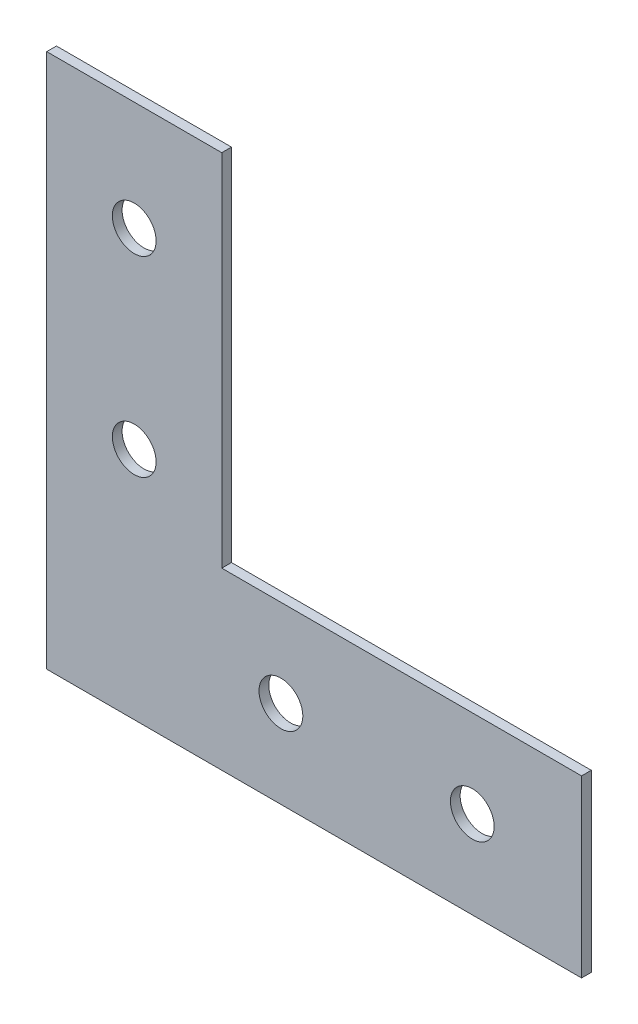
ISO-10303-21;
HEADER;
FILE_DESCRIPTION(('STEP AP214'),'2;1');
FILE_NAME('part.step','',(''),(''),'','','');
FILE_SCHEMA(('AUTOMOTIVE_DESIGN { 1 0 10303 214 1 1 1 1 }'));
ENDSEC;
DATA;
#1=APPLICATION_CONTEXT('core data for automotive mechanical design processes');
#2=APPLICATION_PROTOCOL_DEFINITION('international standard','automotive_design',2000,#1);
#3=PRODUCT_CONTEXT('',#1,'mechanical');
#4=PRODUCT('Part','Part','',(#3));
#5=PRODUCT_RELATED_PRODUCT_CATEGORY('part','',(#4));
#6=PRODUCT_DEFINITION_FORMATION('','',#4);
#7=PRODUCT_DEFINITION_CONTEXT('part definition',#1,'design');
#8=PRODUCT_DEFINITION('design','',#6,#7);
#9=PRODUCT_DEFINITION_SHAPE('','',#8);
#10=(LENGTH_UNIT() NAMED_UNIT(*) SI_UNIT(.MILLI.,.METRE.));
#11=(NAMED_UNIT(*) PLANE_ANGLE_UNIT() SI_UNIT($,.RADIAN.));
#12=(NAMED_UNIT(*) SI_UNIT($,.STERADIAN.) SOLID_ANGLE_UNIT());
#13=UNCERTAINTY_MEASURE_WITH_UNIT(LENGTH_MEASURE(1.E-05),#10,'distance_accuracy_value','');
#14=(GEOMETRIC_REPRESENTATION_CONTEXT(3) GLOBAL_UNCERTAINTY_ASSIGNED_CONTEXT((#13)) GLOBAL_UNIT_ASSIGNED_CONTEXT((#10,
#11,#12)) REPRESENTATION_CONTEXT('',''));
#15=CARTESIAN_POINT('',(0.,0.,0.));
#16=DIRECTION('',(0.,0.,1.));
#17=DIRECTION('',(1.,0.,0.));
#18=AXIS2_PLACEMENT_3D('',#15,#16,#17);
#19=CARTESIAN_POINT('',(18.,-55.,2.));
#20=DIRECTION('',(-1.,0.,0.));
#21=DIRECTION('',(0.,0.,1.));
#22=AXIS2_PLACEMENT_3D('',#19,#20,#21);
#23=PLANE('',#22);
#24=DIRECTION('',(0.,1.,0.));
#25=VECTOR('',#24,1.);
#26=CARTESIAN_POINT('',(18.,-55.,2.));
#27=LINE('',#26,#25);
#28=CARTESIAN_POINT('',(18.,-19.,2.));
#29=VERTEX_POINT('',#28);
#30=CARTESIAN_POINT('',(18.,55.,2.));
#31=VERTEX_POINT('',#30);
#32=EDGE_CURVE('E73',#29,#31,#27,.T.);
#33=ORIENTED_EDGE('',*,*,#32,.F.);
#34=DIRECTION('',(0.,0.,-1.));
#35=VECTOR('',#34,1.);
#36=CARTESIAN_POINT('',(18.,-19.,2.));
#37=LINE('',#36,#35);
#38=CARTESIAN_POINT('',(18.,-19.,0.));
#39=VERTEX_POINT('',#38);
#40=EDGE_CURVE('E121',#29,#39,#37,.T.);
#41=ORIENTED_EDGE('',*,*,#40,.T.);
#42=DIRECTION('',(0.,1.,0.));
#43=VECTOR('',#42,1.);
#44=CARTESIAN_POINT('',(18.,-55.,0.));
#45=LINE('',#44,#43);
#46=CARTESIAN_POINT('',(18.,55.,0.));
#47=VERTEX_POINT('',#46);
#48=EDGE_CURVE('E125',#39,#47,#45,.T.);
#49=ORIENTED_EDGE('',*,*,#48,.T.);
#50=DIRECTION('',(0.,0.,-1.));
#51=VECTOR('',#50,1.);
#52=CARTESIAN_POINT('',(18.,55.,2.));
#53=LINE('',#52,#51);
#54=EDGE_CURVE('E11',#31,#47,#53,.T.);
#55=ORIENTED_EDGE('',*,*,#54,.F.);
#56=EDGE_LOOP('',(#33,#41,#49,#55));
#57=FACE_BOUND('',#56,.T.);
#58=ADVANCED_FACE('F31',(#57),#23,.F.);
#59=CARTESIAN_POINT('',(-18.,55.,2.));
#60=DIRECTION('',(0.,-1.,0.));
#61=DIRECTION('',(0.,0.,-1.));
#62=AXIS2_PLACEMENT_3D('',#59,#60,#61);
#63=PLANE('',#62);
#64=DIRECTION('',(-1.,0.,0.));
#65=VECTOR('',#64,1.);
#66=CARTESIAN_POINT('',(-18.,55.,0.));
#67=LINE('',#66,#65);
#68=CARTESIAN_POINT('',(-18.,55.,0.));
#69=VERTEX_POINT('',#68);
#70=EDGE_CURVE('E133',#47,#69,#67,.T.);
#71=ORIENTED_EDGE('',*,*,#70,.T.);
#72=DIRECTION('',(0.,0.,-1.));
#73=VECTOR('',#72,1.);
#74=CARTESIAN_POINT('',(-18.,55.,2.));
#75=LINE('',#74,#73);
#76=CARTESIAN_POINT('',(-18.,55.,2.));
#77=VERTEX_POINT('',#76);
#78=EDGE_CURVE('E38',#77,#69,#75,.T.);
#79=ORIENTED_EDGE('',*,*,#78,.F.);
#80=DIRECTION('',(-1.,0.,0.));
#81=VECTOR('',#80,1.);
#82=CARTESIAN_POINT('',(-18.,55.,2.));
#83=LINE('',#82,#81);
#84=EDGE_CURVE('E127',#31,#77,#83,.T.);
#85=ORIENTED_EDGE('',*,*,#84,.F.);
#86=ORIENTED_EDGE('',*,*,#54,.T.);
#87=EDGE_LOOP('',(#71,#79,#85,#86));
#88=FACE_BOUND('',#87,.T.);
#89=ADVANCED_FACE('F141',(#88),#63,.F.);
#90=CARTESIAN_POINT('',(-18.,-55.,2.));
#91=DIRECTION('',(1.,0.,0.));
#92=DIRECTION('',(0.,0.,-1.));
#93=AXIS2_PLACEMENT_3D('',#90,#91,#92);
#94=PLANE('',#93);
#95=DIRECTION('',(0.,-1.,0.));
#96=VECTOR('',#95,1.);
#97=CARTESIAN_POINT('',(-18.,-55.,0.));
#98=LINE('',#97,#96);
#99=CARTESIAN_POINT('',(-18.,-55.,0.));
#100=VERTEX_POINT('',#99);
#101=EDGE_CURVE('E70',#69,#100,#98,.T.);
#102=ORIENTED_EDGE('',*,*,#101,.T.);
#103=DIRECTION('',(0.,0.,-1.));
#104=VECTOR('',#103,1.);
#105=CARTESIAN_POINT('',(-18.,-55.,2.));
#106=LINE('',#105,#104);
#107=CARTESIAN_POINT('',(-18.,-55.,2.));
#108=VERTEX_POINT('',#107);
#109=EDGE_CURVE('E97',#108,#100,#106,.T.);
#110=ORIENTED_EDGE('',*,*,#109,.F.);
#111=DIRECTION('',(0.,-1.,0.));
#112=VECTOR('',#111,1.);
#113=CARTESIAN_POINT('',(-18.,-55.,2.));
#114=LINE('',#113,#112);
#115=EDGE_CURVE('E53',#77,#108,#114,.T.);
#116=ORIENTED_EDGE('',*,*,#115,.F.);
#117=ORIENTED_EDGE('',*,*,#78,.T.);
#118=EDGE_LOOP('',(#102,#110,#116,#117));
#119=FACE_BOUND('',#118,.T.);
#120=ADVANCED_FACE('F137',(#119),#94,.F.);
#121=CARTESIAN_POINT('',(-18.,-55.,2.));
#122=DIRECTION('',(0.,1.,0.));
#123=DIRECTION('',(0.,0.,1.));
#124=AXIS2_PLACEMENT_3D('',#121,#122,#123);
#125=PLANE('',#124);
#126=DIRECTION('',(1.,0.,0.));
#127=VECTOR('',#126,1.);
#128=CARTESIAN_POINT('',(-18.,-55.,0.));
#129=LINE('',#128,#127);
#130=CARTESIAN_POINT('',(92.,-55.,0.));
#131=VERTEX_POINT('',#130);
#132=EDGE_CURVE('E91',#100,#131,#129,.T.);
#133=ORIENTED_EDGE('',*,*,#132,.T.);
#134=DIRECTION('',(0.,0.,1.));
#135=VECTOR('',#134,1.);
#136=CARTESIAN_POINT('',(92.,-55.,0.));
#137=LINE('',#136,#135);
#138=CARTESIAN_POINT('',(92.,-55.,2.));
#139=VERTEX_POINT('',#138);
#140=EDGE_CURVE('E95',#131,#139,#137,.T.);
#141=ORIENTED_EDGE('',*,*,#140,.T.);
#142=DIRECTION('',(1.,0.,0.));
#143=VECTOR('',#142,1.);
#144=CARTESIAN_POINT('',(-18.,-55.,2.));
#145=LINE('',#144,#143);
#146=EDGE_CURVE('E130',#108,#139,#145,.T.);
#147=ORIENTED_EDGE('',*,*,#146,.F.);
#148=ORIENTED_EDGE('',*,*,#109,.T.);
#149=EDGE_LOOP('',(#133,#141,#147,#148));
#150=FACE_BOUND('',#149,.T.);
#151=ADVANCED_FACE('F93',(#150),#125,.F.);
#152=CARTESIAN_POINT('',(18.,55.,2.));
#153=DIRECTION('',(0.,0.,-1.));
#154=DIRECTION('',(-1.,0.,0.));
#155=AXIS2_PLACEMENT_3D('',#152,#153,#154);
#156=PLANE('',#155);
#157=CARTESIAN_POINT('',(69.5257190863466,-37.,2.));
#158=DIRECTION('',(0.,0.,1.));
#159=DIRECTION('',(-1.,0.,0.));
#160=AXIS2_PLACEMENT_3D('',#157,#158,#159);
#161=CIRCLE('',#160,4.50000000000001);
#162=CARTESIAN_POINT('',(65.0257190863466,-37.,2.));
#163=VERTEX_POINT('',#162);
#164=EDGE_CURVE('E250',#163,#163,#161,.T.);
#165=ORIENTED_EDGE('',*,*,#164,.F.);
#166=EDGE_LOOP('',(#165));
#167=FACE_BOUND('',#166,.T.);
#168=CARTESIAN_POINT('',(30.1668657381625,-37.,2.));
#169=DIRECTION('',(0.,0.,1.));
#170=DIRECTION('',(-1.,0.,0.));
#171=AXIS2_PLACEMENT_3D('',#168,#169,#170);
#172=CIRCLE('',#171,4.5);
#173=CARTESIAN_POINT('',(25.6668657381625,-37.,2.));
#174=VERTEX_POINT('',#173);
#175=EDGE_CURVE('E252',#174,#174,#172,.T.);
#176=ORIENTED_EDGE('',*,*,#175,.F.);
#177=EDGE_LOOP('',(#176));
#178=FACE_BOUND('',#177,.T.);
#179=CARTESIAN_POINT('',(0.,-6.83313426183751,2.));
#180=DIRECTION('',(0.,0.,1.));
#181=DIRECTION('',(1.,0.,0.));
#182=AXIS2_PLACEMENT_3D('',#179,#180,#181);
#183=CIRCLE('',#182,4.5);
#184=CARTESIAN_POINT('',(4.5,-6.83313426183751,2.));
#185=VERTEX_POINT('',#184);
#186=EDGE_CURVE('E258',#185,#185,#183,.T.);
#187=ORIENTED_EDGE('',*,*,#186,.F.);
#188=EDGE_LOOP('',(#187));
#189=FACE_BOUND('',#188,.T.);
#190=CARTESIAN_POINT('',(0.,32.5257190863466,2.));
#191=DIRECTION('',(0.,0.,1.));
#192=DIRECTION('',(1.,0.,0.));
#193=AXIS2_PLACEMENT_3D('',#190,#191,#192);
#194=CIRCLE('',#193,4.5);
#195=CARTESIAN_POINT('',(4.5,32.5257190863466,2.));
#196=VERTEX_POINT('',#195);
#197=EDGE_CURVE('E116',#196,#196,#194,.T.);
#198=ORIENTED_EDGE('',*,*,#197,.F.);
#199=EDGE_LOOP('',(#198));
#200=FACE_BOUND('',#199,.T.);
#201=ORIENTED_EDGE('',*,*,#115,.T.);
#202=ORIENTED_EDGE('',*,*,#146,.T.);
#203=DIRECTION('',(0.,1.,0.));
#204=VECTOR('',#203,1.);
#205=CARTESIAN_POINT('',(92.,-55.,2.));
#206=LINE('',#205,#204);
#207=CARTESIAN_POINT('',(92.,-19.,2.));
#208=VERTEX_POINT('',#207);
#209=EDGE_CURVE('E106',#139,#208,#206,.T.);
#210=ORIENTED_EDGE('',*,*,#209,.T.);
#211=DIRECTION('',(-1.,0.,0.));
#212=VECTOR('',#211,1.);
#213=CARTESIAN_POINT('',(-18.,-19.,2.));
#214=LINE('',#213,#212);
#215=EDGE_CURVE('E45',#208,#29,#214,.T.);
#216=ORIENTED_EDGE('',*,*,#215,.T.);
#217=ORIENTED_EDGE('',*,*,#32,.T.);
#218=ORIENTED_EDGE('',*,*,#84,.T.);
#219=EDGE_LOOP('',(#201,#202,#210,#216,#217,#218));
#220=FACE_BOUND('',#219,.T.);
#221=ADVANCED_FACE('F145',(#167,#178,#189,#200,#220),#156,.F.);
#222=CARTESIAN_POINT('',(18.,55.,0.));
#223=DIRECTION('',(0.,0.,-1.));
#224=DIRECTION('',(-1.,0.,0.));
#225=AXIS2_PLACEMENT_3D('',#222,#223,#224);
#226=PLANE('',#225);
#227=CARTESIAN_POINT('',(69.5257190863466,-37.,0.));
#228=DIRECTION('',(0.,0.,1.));
#229=DIRECTION('',(-1.,0.,0.));
#230=AXIS2_PLACEMENT_3D('',#227,#228,#229);
#231=CIRCLE('',#230,4.50000000000001);
#232=CARTESIAN_POINT('',(65.0257190863466,-37.,0.));
#233=VERTEX_POINT('',#232);
#234=EDGE_CURVE('E248',#233,#233,#231,.T.);
#235=ORIENTED_EDGE('',*,*,#234,.T.);
#236=EDGE_LOOP('',(#235));
#237=FACE_BOUND('',#236,.T.);
#238=CARTESIAN_POINT('',(30.1668657381625,-37.,0.));
#239=DIRECTION('',(0.,0.,1.));
#240=DIRECTION('',(-1.,0.,0.));
#241=AXIS2_PLACEMENT_3D('',#238,#239,#240);
#242=CIRCLE('',#241,4.5);
#243=CARTESIAN_POINT('',(25.6668657381625,-37.,0.));
#244=VERTEX_POINT('',#243);
#245=EDGE_CURVE('E255',#244,#244,#242,.T.);
#246=ORIENTED_EDGE('',*,*,#245,.T.);
#247=EDGE_LOOP('',(#246));
#248=FACE_BOUND('',#247,.T.);
#249=CARTESIAN_POINT('',(0.,-6.83313426183751,0.));
#250=DIRECTION('',(0.,0.,1.));
#251=DIRECTION('',(1.,0.,0.));
#252=AXIS2_PLACEMENT_3D('',#249,#250,#251);
#253=CIRCLE('',#252,4.5);
#254=CARTESIAN_POINT('',(4.5,-6.83313426183751,0.));
#255=VERTEX_POINT('',#254);
#256=EDGE_CURVE('E261',#255,#255,#253,.T.);
#257=ORIENTED_EDGE('',*,*,#256,.T.);
#258=EDGE_LOOP('',(#257));
#259=FACE_BOUND('',#258,.T.);
#260=CARTESIAN_POINT('',(0.,32.5257190863466,0.));
#261=DIRECTION('',(0.,0.,1.));
#262=DIRECTION('',(1.,0.,0.));
#263=AXIS2_PLACEMENT_3D('',#260,#261,#262);
#264=CIRCLE('',#263,4.5);
#265=CARTESIAN_POINT('',(4.5,32.5257190863466,0.));
#266=VERTEX_POINT('',#265);
#267=EDGE_CURVE('E119',#266,#266,#264,.T.);
#268=ORIENTED_EDGE('',*,*,#267,.T.);
#269=EDGE_LOOP('',(#268));
#270=FACE_BOUND('',#269,.T.);
#271=ORIENTED_EDGE('',*,*,#48,.F.);
#272=DIRECTION('',(-1.,0.,0.));
#273=VECTOR('',#272,1.);
#274=CARTESIAN_POINT('',(-18.,-19.,0.));
#275=LINE('',#274,#273);
#276=CARTESIAN_POINT('',(92.,-19.,0.));
#277=VERTEX_POINT('',#276);
#278=EDGE_CURVE('E108',#277,#39,#275,.T.);
#279=ORIENTED_EDGE('',*,*,#278,.F.);
#280=DIRECTION('',(0.,1.,0.));
#281=VECTOR('',#280,1.);
#282=CARTESIAN_POINT('',(92.,-55.,0.));
#283=LINE('',#282,#281);
#284=EDGE_CURVE('E104',#131,#277,#283,.T.);
#285=ORIENTED_EDGE('',*,*,#284,.F.);
#286=ORIENTED_EDGE('',*,*,#132,.F.);
#287=ORIENTED_EDGE('',*,*,#101,.F.);
#288=ORIENTED_EDGE('',*,*,#70,.F.);
#289=EDGE_LOOP('',(#271,#279,#285,#286,#287,#288));
#290=FACE_BOUND('',#289,.T.);
#291=ADVANCED_FACE('F111',(#237,#248,#259,#270,#290),#226,.T.);
#292=CARTESIAN_POINT('',(-18.,-19.,0.));
#293=DIRECTION('',(0.,1.,0.));
#294=DIRECTION('',(0.,0.,1.));
#295=AXIS2_PLACEMENT_3D('',#292,#293,#294);
#296=PLANE('',#295);
#297=ORIENTED_EDGE('',*,*,#40,.F.);
#298=ORIENTED_EDGE('',*,*,#215,.F.);
#299=DIRECTION('',(0.,0.,1.));
#300=VECTOR('',#299,1.);
#301=CARTESIAN_POINT('',(92.,-19.,0.));
#302=LINE('',#301,#300);
#303=EDGE_CURVE('E107',#277,#208,#302,.T.);
#304=ORIENTED_EDGE('',*,*,#303,.F.);
#305=ORIENTED_EDGE('',*,*,#278,.T.);
#306=EDGE_LOOP('',(#297,#298,#304,#305));
#307=FACE_BOUND('',#306,.T.);
#308=ADVANCED_FACE('F144',(#307),#296,.T.);
#309=CARTESIAN_POINT('',(92.,-55.,0.));
#310=DIRECTION('',(1.,0.,0.));
#311=DIRECTION('',(0.,0.,-1.));
#312=AXIS2_PLACEMENT_3D('',#309,#310,#311);
#313=PLANE('',#312);
#314=ORIENTED_EDGE('',*,*,#209,.F.);
#315=ORIENTED_EDGE('',*,*,#140,.F.);
#316=ORIENTED_EDGE('',*,*,#284,.T.);
#317=ORIENTED_EDGE('',*,*,#303,.T.);
#318=EDGE_LOOP('',(#314,#315,#316,#317));
#319=FACE_BOUND('',#318,.T.);
#320=ADVANCED_FACE('F103',(#319),#313,.T.);
#321=CARTESIAN_POINT('',(0.,32.5257190863466,0.));
#322=DIRECTION('',(0.,0.,1.));
#323=DIRECTION('',(1.,0.,0.));
#324=AXIS2_PLACEMENT_3D('',#321,#322,#323);
#325=CYLINDRICAL_SURFACE('',#324,4.5);
#326=ORIENTED_EDGE('',*,*,#267,.F.);
#327=EDGE_LOOP('',(#326));
#328=FACE_BOUND('',#327,.T.);
#329=ORIENTED_EDGE('',*,*,#197,.T.);
#330=EDGE_LOOP('',(#329));
#331=FACE_BOUND('',#330,.T.);
#332=ADVANCED_FACE('F193',(#328,#331),#325,.F.);
#333=CARTESIAN_POINT('',(0.,-6.83313426183751,0.));
#334=DIRECTION('',(0.,0.,1.));
#335=DIRECTION('',(1.,0.,0.));
#336=AXIS2_PLACEMENT_3D('',#333,#334,#335);
#337=CYLINDRICAL_SURFACE('',#336,4.5);
#338=ORIENTED_EDGE('',*,*,#256,.F.);
#339=EDGE_LOOP('',(#338));
#340=FACE_BOUND('',#339,.T.);
#341=ORIENTED_EDGE('',*,*,#186,.T.);
#342=EDGE_LOOP('',(#341));
#343=FACE_BOUND('',#342,.T.);
#344=ADVANCED_FACE('F211',(#340,#343),#337,.F.);
#345=CARTESIAN_POINT('',(30.1668657381625,-37.,0.));
#346=DIRECTION('',(0.,0.,1.));
#347=DIRECTION('',(1.,0.,0.));
#348=AXIS2_PLACEMENT_3D('',#345,#346,#347);
#349=CYLINDRICAL_SURFACE('',#348,4.5);
#350=ORIENTED_EDGE('',*,*,#245,.F.);
#351=EDGE_LOOP('',(#350));
#352=FACE_BOUND('',#351,.T.);
#353=ORIENTED_EDGE('',*,*,#175,.T.);
#354=EDGE_LOOP('',(#353));
#355=FACE_BOUND('',#354,.T.);
#356=ADVANCED_FACE('F221',(#352,#355),#349,.F.);
#357=CARTESIAN_POINT('',(69.5257190863466,-37.,0.));
#358=DIRECTION('',(0.,0.,1.));
#359=DIRECTION('',(1.,0.,0.));
#360=AXIS2_PLACEMENT_3D('',#357,#358,#359);
#361=CYLINDRICAL_SURFACE('',#360,4.50000000000001);
#362=ORIENTED_EDGE('',*,*,#234,.F.);
#363=EDGE_LOOP('',(#362));
#364=FACE_BOUND('',#363,.T.);
#365=ORIENTED_EDGE('',*,*,#164,.T.);
#366=EDGE_LOOP('',(#365));
#367=FACE_BOUND('',#366,.T.);
#368=ADVANCED_FACE('F231',(#364,#367),#361,.F.);
#369=CLOSED_SHELL('',(#58,#89,#120,#151,#221,#291,#308,#320,#332,#344,#356,#368));
#370=MANIFOLD_SOLID_BREP('B2',#369);
#371=ADVANCED_BREP_SHAPE_REPRESENTATION('',(#18,#370),#14);
#372=SHAPE_DEFINITION_REPRESENTATION(#9,#371);
ENDSEC;
END-ISO-10303-21;
